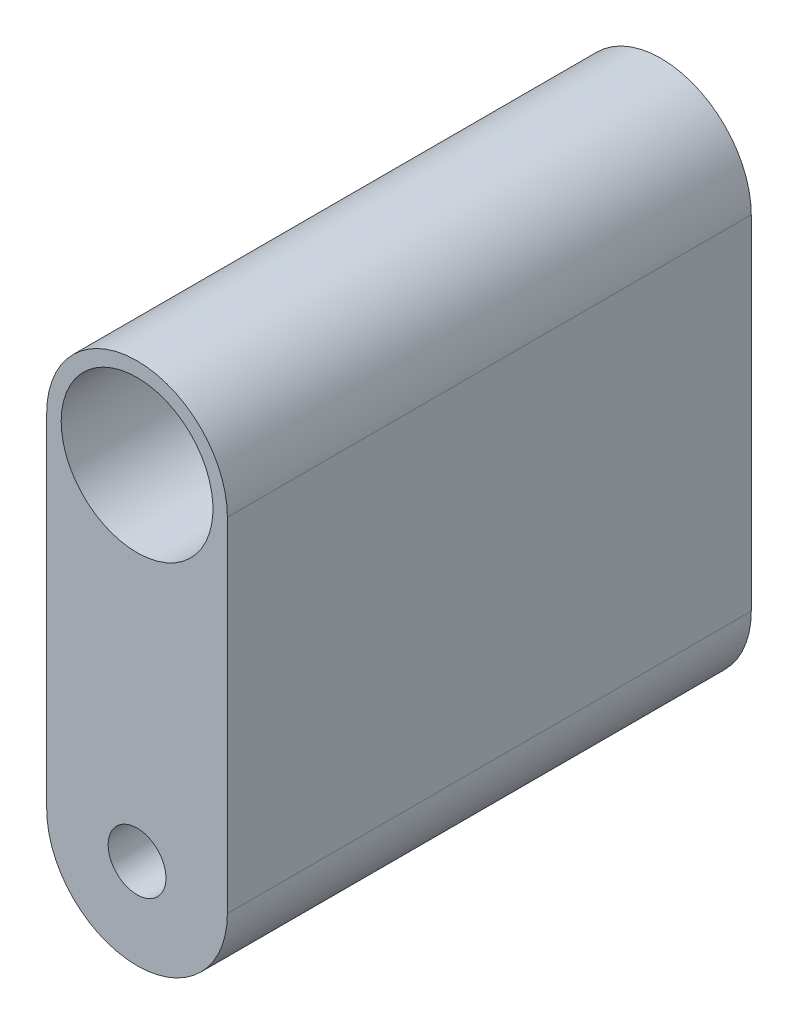
ISO-10303-21;
HEADER;
FILE_DESCRIPTION(('STEP AP214'),'2;1');
FILE_NAME('part.step','',(''),(''),'','','');
FILE_SCHEMA(('AUTOMOTIVE_DESIGN { 1 0 10303 214 1 1 1 1 }'));
ENDSEC;
DATA;
#1=APPLICATION_CONTEXT('core data for automotive mechanical design processes');
#2=APPLICATION_PROTOCOL_DEFINITION('international standard','automotive_design',2000,#1);
#3=PRODUCT_CONTEXT('',#1,'mechanical');
#4=PRODUCT('Part','Part','',(#3));
#5=PRODUCT_RELATED_PRODUCT_CATEGORY('part','',(#4));
#6=PRODUCT_DEFINITION_FORMATION('','',#4);
#7=PRODUCT_DEFINITION_CONTEXT('part definition',#1,'design');
#8=PRODUCT_DEFINITION('design','',#6,#7);
#9=PRODUCT_DEFINITION_SHAPE('','',#8);
#10=(LENGTH_UNIT() NAMED_UNIT(*) SI_UNIT(.MILLI.,.METRE.));
#11=(NAMED_UNIT(*) PLANE_ANGLE_UNIT() SI_UNIT($,.RADIAN.));
#12=(NAMED_UNIT(*) SI_UNIT($,.STERADIAN.) SOLID_ANGLE_UNIT());
#13=UNCERTAINTY_MEASURE_WITH_UNIT(LENGTH_MEASURE(1.E-05),#10,'distance_accuracy_value','');
#14=(GEOMETRIC_REPRESENTATION_CONTEXT(3) GLOBAL_UNCERTAINTY_ASSIGNED_CONTEXT((#13)) GLOBAL_UNIT_ASSIGNED_CONTEXT((#10,
#11,#12)) REPRESENTATION_CONTEXT('',''));
#15=CARTESIAN_POINT('',(0.,0.,0.));
#16=DIRECTION('',(0.,0.,1.));
#17=DIRECTION('',(1.,0.,0.));
#18=AXIS2_PLACEMENT_3D('',#15,#16,#17);
#19=CARTESIAN_POINT('',(0.,0.,29.));
#20=DIRECTION('',(0.,0.,1.));
#21=DIRECTION('',(1.,0.,0.));
#22=AXIS2_PLACEMENT_3D('',#19,#20,#21);
#23=PLANE('',#22);
#24=CARTESIAN_POINT('',(0.,0.,29.));
#25=DIRECTION('',(0.,0.,1.));
#26=DIRECTION('',(1.,0.,0.));
#27=AXIS2_PLACEMENT_3D('',#24,#25,#26);
#28=CIRCLE('',#27,1.6);
#29=CARTESIAN_POINT('',(-1.6,0.,29.));
#30=VERTEX_POINT('',#29);
#31=EDGE_CURVE('E118',#30,#30,#28,.T.);
#32=ORIENTED_EDGE('',*,*,#31,.F.);
#33=EDGE_LOOP('',(#32));
#34=FACE_BOUND('',#33,.T.);
#35=CARTESIAN_POINT('',(0.,0.,29.));
#36=DIRECTION('',(0.,0.,1.));
#37=DIRECTION('',(1.,0.,0.));
#38=AXIS2_PLACEMENT_3D('',#35,#36,#37);
#39=CIRCLE('',#38,5.);
#40=CARTESIAN_POINT('',(-5.,0.,29.));
#41=VERTEX_POINT('',#40);
#42=CARTESIAN_POINT('',(5.,0.,29.));
#43=VERTEX_POINT('',#42);
#44=EDGE_CURVE('E98',#41,#43,#39,.T.);
#45=ORIENTED_EDGE('',*,*,#44,.T.);
#46=DIRECTION('',(0.,1.,0.));
#47=VECTOR('',#46,1.);
#48=CARTESIAN_POINT('',(5.,0.,29.));
#49=LINE('',#48,#47);
#50=CARTESIAN_POINT('',(5.,19.,29.));
#51=VERTEX_POINT('',#50);
#52=EDGE_CURVE('E93',#43,#51,#49,.T.);
#53=ORIENTED_EDGE('',*,*,#52,.T.);
#54=CARTESIAN_POINT('',(0.,19.,29.));
#55=DIRECTION('',(0.,0.,1.));
#56=DIRECTION('',(1.,0.,0.));
#57=AXIS2_PLACEMENT_3D('',#54,#55,#56);
#58=CIRCLE('',#57,5.);
#59=CARTESIAN_POINT('',(-5.,19.,29.));
#60=VERTEX_POINT('',#59);
#61=EDGE_CURVE('E96',#51,#60,#58,.T.);
#62=ORIENTED_EDGE('',*,*,#61,.T.);
#63=DIRECTION('',(0.,-1.,0.));
#64=VECTOR('',#63,1.);
#65=CARTESIAN_POINT('',(-5.,0.,29.));
#66=LINE('',#65,#64);
#67=EDGE_CURVE('E63',#60,#41,#66,.T.);
#68=ORIENTED_EDGE('',*,*,#67,.T.);
#69=EDGE_LOOP('',(#45,#53,#62,#68));
#70=FACE_BOUND('',#69,.T.);
#71=CARTESIAN_POINT('',(0.,19.,29.));
#72=DIRECTION('',(0.,0.,1.));
#73=DIRECTION('',(1.,0.,0.));
#74=AXIS2_PLACEMENT_3D('',#71,#72,#73);
#75=CIRCLE('',#74,4.2);
#76=CARTESIAN_POINT('',(-4.2,19.,29.));
#77=VERTEX_POINT('',#76);
#78=EDGE_CURVE('E140',#77,#77,#75,.T.);
#79=ORIENTED_EDGE('',*,*,#78,.F.);
#80=EDGE_LOOP('',(#79));
#81=FACE_BOUND('',#80,.T.);
#82=ADVANCED_FACE('F45',(#34,#70,#81),#23,.T.);
#83=CARTESIAN_POINT('',(0.,0.,0.));
#84=DIRECTION('',(0.,0.,1.));
#85=DIRECTION('',(1.,0.,0.));
#86=AXIS2_PLACEMENT_3D('',#83,#84,#85);
#87=PLANE('',#86);
#88=CARTESIAN_POINT('',(0.,0.,0.));
#89=DIRECTION('',(0.,0.,1.));
#90=DIRECTION('',(1.,0.,0.));
#91=AXIS2_PLACEMENT_3D('',#88,#89,#90);
#92=CIRCLE('',#91,5.);
#93=CARTESIAN_POINT('',(-5.,0.,0.));
#94=VERTEX_POINT('',#93);
#95=CARTESIAN_POINT('',(5.,0.,0.));
#96=VERTEX_POINT('',#95);
#97=EDGE_CURVE('E114',#94,#96,#92,.T.);
#98=ORIENTED_EDGE('',*,*,#97,.F.);
#99=DIRECTION('',(0.,-1.,0.));
#100=VECTOR('',#99,1.);
#101=CARTESIAN_POINT('',(-5.,0.,0.));
#102=LINE('',#101,#100);
#103=CARTESIAN_POINT('',(-5.,19.,0.));
#104=VERTEX_POINT('',#103);
#105=EDGE_CURVE('E86',#104,#94,#102,.T.);
#106=ORIENTED_EDGE('',*,*,#105,.F.);
#107=CARTESIAN_POINT('',(0.,19.,0.));
#108=DIRECTION('',(0.,0.,1.));
#109=DIRECTION('',(1.,0.,0.));
#110=AXIS2_PLACEMENT_3D('',#107,#108,#109);
#111=CIRCLE('',#110,5.);
#112=CARTESIAN_POINT('',(5.,19.,0.));
#113=VERTEX_POINT('',#112);
#114=EDGE_CURVE('E80',#113,#104,#111,.T.);
#115=ORIENTED_EDGE('',*,*,#114,.F.);
#116=DIRECTION('',(0.,1.,0.));
#117=VECTOR('',#116,1.);
#118=CARTESIAN_POINT('',(5.,0.,0.));
#119=LINE('',#118,#117);
#120=EDGE_CURVE('E103',#96,#113,#119,.T.);
#121=ORIENTED_EDGE('',*,*,#120,.F.);
#122=EDGE_LOOP('',(#98,#106,#115,#121));
#123=FACE_BOUND('',#122,.T.);
#124=CARTESIAN_POINT('',(0.,0.,0.));
#125=DIRECTION('',(0.,0.,1.));
#126=DIRECTION('',(1.,0.,0.));
#127=AXIS2_PLACEMENT_3D('',#124,#125,#126);
#128=CIRCLE('',#127,1.6);
#129=CARTESIAN_POINT('',(-1.6,0.,0.));
#130=VERTEX_POINT('',#129);
#131=EDGE_CURVE('E136',#130,#130,#128,.T.);
#132=ORIENTED_EDGE('',*,*,#131,.T.);
#133=EDGE_LOOP('',(#132));
#134=FACE_BOUND('',#133,.T.);
#135=CARTESIAN_POINT('',(0.,19.,0.));
#136=DIRECTION('',(0.,0.,1.));
#137=DIRECTION('',(1.,0.,0.));
#138=AXIS2_PLACEMENT_3D('',#135,#136,#137);
#139=CIRCLE('',#138,4.2);
#140=CARTESIAN_POINT('',(-4.2,19.,0.));
#141=VERTEX_POINT('',#140);
#142=EDGE_CURVE('E144',#141,#141,#139,.T.);
#143=ORIENTED_EDGE('',*,*,#142,.T.);
#144=EDGE_LOOP('',(#143));
#145=FACE_BOUND('',#144,.T.);
#146=ADVANCED_FACE('F131',(#123,#134,#145),#87,.F.);
#147=CARTESIAN_POINT('',(0.,0.,29.));
#148=DIRECTION('',(0.,0.,-1.));
#149=DIRECTION('',(-1.,0.,0.));
#150=AXIS2_PLACEMENT_3D('',#147,#148,#149);
#151=CYLINDRICAL_SURFACE('',#150,5.);
#152=ORIENTED_EDGE('',*,*,#97,.T.);
#153=DIRECTION('',(0.,0.,-1.));
#154=VECTOR('',#153,1.);
#155=CARTESIAN_POINT('',(5.,0.,29.));
#156=LINE('',#155,#154);
#157=EDGE_CURVE('E11',#43,#96,#156,.T.);
#158=ORIENTED_EDGE('',*,*,#157,.F.);
#159=ORIENTED_EDGE('',*,*,#44,.F.);
#160=DIRECTION('',(0.,0.,-1.));
#161=VECTOR('',#160,1.);
#162=CARTESIAN_POINT('',(-5.,0.,29.));
#163=LINE('',#162,#161);
#164=EDGE_CURVE('E110',#41,#94,#163,.T.);
#165=ORIENTED_EDGE('',*,*,#164,.T.);
#166=EDGE_LOOP('',(#152,#158,#159,#165));
#167=FACE_BOUND('',#166,.T.);
#168=ADVANCED_FACE('F47',(#167),#151,.T.);
#169=CARTESIAN_POINT('',(5.,0.,29.));
#170=DIRECTION('',(-1.,0.,0.));
#171=DIRECTION('',(0.,0.,1.));
#172=AXIS2_PLACEMENT_3D('',#169,#170,#171);
#173=PLANE('',#172);
#174=ORIENTED_EDGE('',*,*,#120,.T.);
#175=DIRECTION('',(0.,0.,-1.));
#176=VECTOR('',#175,1.);
#177=CARTESIAN_POINT('',(5.,19.,29.));
#178=LINE('',#177,#176);
#179=EDGE_CURVE('E55',#51,#113,#178,.T.);
#180=ORIENTED_EDGE('',*,*,#179,.F.);
#181=ORIENTED_EDGE('',*,*,#52,.F.);
#182=ORIENTED_EDGE('',*,*,#157,.T.);
#183=EDGE_LOOP('',(#174,#180,#181,#182));
#184=FACE_BOUND('',#183,.T.);
#185=ADVANCED_FACE('F102',(#184),#173,.F.);
#186=CARTESIAN_POINT('',(0.,19.,29.));
#187=DIRECTION('',(0.,0.,-1.));
#188=DIRECTION('',(-1.,0.,0.));
#189=AXIS2_PLACEMENT_3D('',#186,#187,#188);
#190=CYLINDRICAL_SURFACE('',#189,5.);
#191=ORIENTED_EDGE('',*,*,#114,.T.);
#192=DIRECTION('',(0.,0.,-1.));
#193=VECTOR('',#192,1.);
#194=CARTESIAN_POINT('',(-5.,19.,29.));
#195=LINE('',#194,#193);
#196=EDGE_CURVE('E105',#60,#104,#195,.T.);
#197=ORIENTED_EDGE('',*,*,#196,.F.);
#198=ORIENTED_EDGE('',*,*,#61,.F.);
#199=ORIENTED_EDGE('',*,*,#179,.T.);
#200=EDGE_LOOP('',(#191,#197,#198,#199));
#201=FACE_BOUND('',#200,.T.);
#202=ADVANCED_FACE('F106',(#201),#190,.T.);
#203=CARTESIAN_POINT('',(-5.,0.,29.));
#204=DIRECTION('',(1.,0.,0.));
#205=DIRECTION('',(0.,0.,-1.));
#206=AXIS2_PLACEMENT_3D('',#203,#204,#205);
#207=PLANE('',#206);
#208=ORIENTED_EDGE('',*,*,#105,.T.);
#209=ORIENTED_EDGE('',*,*,#164,.F.);
#210=ORIENTED_EDGE('',*,*,#67,.F.);
#211=ORIENTED_EDGE('',*,*,#196,.T.);
#212=EDGE_LOOP('',(#208,#209,#210,#211));
#213=FACE_BOUND('',#212,.T.);
#214=ADVANCED_FACE('F128',(#213),#207,.F.);
#215=CARTESIAN_POINT('',(0.,0.,29.));
#216=DIRECTION('',(0.,0.,-1.));
#217=DIRECTION('',(-1.,0.,0.));
#218=AXIS2_PLACEMENT_3D('',#215,#216,#217);
#219=CYLINDRICAL_SURFACE('',#218,1.6);
#220=CARTESIAN_POINT('',(-1.6,0.,29.));
#221=CARTESIAN_POINT('',(-1.6,0.,28.6979166666667));
#222=CARTESIAN_POINT('',(-1.6,0.,28.3958333333333));
#223=CARTESIAN_POINT('',(-1.6,0.,27.7916666666667));
#224=CARTESIAN_POINT('',(-1.6,0.,27.4895833333333));
#225=CARTESIAN_POINT('',(-1.6,0.,26.8854166666667));
#226=CARTESIAN_POINT('',(-1.6,0.,26.5833333333333));
#227=CARTESIAN_POINT('',(-1.6,0.,25.9791666666667));
#228=CARTESIAN_POINT('',(-1.6,0.,25.6770833333333));
#229=CARTESIAN_POINT('',(-1.6,0.,25.0729166666667));
#230=CARTESIAN_POINT('',(-1.6,0.,24.7708333333333));
#231=CARTESIAN_POINT('',(-1.6,0.,24.1666666666667));
#232=CARTESIAN_POINT('',(-1.6,0.,23.8645833333333));
#233=CARTESIAN_POINT('',(-1.6,0.,23.2604166666667));
#234=CARTESIAN_POINT('',(-1.6,0.,22.9583333333333));
#235=CARTESIAN_POINT('',(-1.6,0.,22.3541666666667));
#236=CARTESIAN_POINT('',(-1.6,0.,22.0520833333333));
#237=CARTESIAN_POINT('',(-1.6,0.,21.4479166666667));
#238=CARTESIAN_POINT('',(-1.6,0.,21.1458333333333));
#239=CARTESIAN_POINT('',(-1.6,0.,20.5416666666667));
#240=CARTESIAN_POINT('',(-1.6,0.,20.2395833333333));
#241=CARTESIAN_POINT('',(-1.6,0.,19.6354166666667));
#242=CARTESIAN_POINT('',(-1.6,0.,19.3333333333333));
#243=CARTESIAN_POINT('',(-1.6,0.,18.7291666666667));
#244=CARTESIAN_POINT('',(-1.6,0.,18.4270833333333));
#245=CARTESIAN_POINT('',(-1.6,0.,17.8229166666667));
#246=CARTESIAN_POINT('',(-1.6,0.,17.5208333333333));
#247=CARTESIAN_POINT('',(-1.6,0.,16.9166666666667));
#248=CARTESIAN_POINT('',(-1.6,0.,16.6145833333333));
#249=CARTESIAN_POINT('',(-1.6,0.,16.0104166666667));
#250=CARTESIAN_POINT('',(-1.6,0.,15.7083333333333));
#251=CARTESIAN_POINT('',(-1.6,0.,15.1041666666667));
#252=CARTESIAN_POINT('',(-1.6,0.,14.8020833333333));
#253=CARTESIAN_POINT('',(-1.6,0.,14.1979166666667));
#254=CARTESIAN_POINT('',(-1.6,0.,13.8958333333333));
#255=CARTESIAN_POINT('',(-1.6,0.,13.2916666666667));
#256=CARTESIAN_POINT('',(-1.6,0.,12.9895833333333));
#257=CARTESIAN_POINT('',(-1.6,0.,12.3854166666667));
#258=CARTESIAN_POINT('',(-1.6,0.,12.0833333333333));
#259=CARTESIAN_POINT('',(-1.6,0.,11.4791666666667));
#260=CARTESIAN_POINT('',(-1.6,0.,11.1770833333333));
#261=CARTESIAN_POINT('',(-1.6,0.,10.5729166666667));
#262=CARTESIAN_POINT('',(-1.6,0.,10.2708333333333));
#263=CARTESIAN_POINT('',(-1.6,0.,9.66666666666667));
#264=CARTESIAN_POINT('',(-1.6,0.,9.36458333333333));
#265=CARTESIAN_POINT('',(-1.6,0.,8.76041666666667));
#266=CARTESIAN_POINT('',(-1.6,0.,8.45833333333333));
#267=CARTESIAN_POINT('',(-1.6,0.,7.85416666666667));
#268=CARTESIAN_POINT('',(-1.6,0.,7.55208333333333));
#269=CARTESIAN_POINT('',(-1.6,0.,6.94791666666667));
#270=CARTESIAN_POINT('',(-1.6,0.,6.64583333333333));
#271=CARTESIAN_POINT('',(-1.6,0.,6.04166666666667));
#272=CARTESIAN_POINT('',(-1.6,0.,5.73958333333333));
#273=CARTESIAN_POINT('',(-1.6,0.,5.13541666666667));
#274=CARTESIAN_POINT('',(-1.6,0.,4.83333333333333));
#275=CARTESIAN_POINT('',(-1.6,0.,4.22916666666667));
#276=CARTESIAN_POINT('',(-1.6,0.,3.92708333333333));
#277=CARTESIAN_POINT('',(-1.6,0.,3.32291666666667));
#278=CARTESIAN_POINT('',(-1.6,0.,3.02083333333333));
#279=CARTESIAN_POINT('',(-1.6,0.,2.41666666666667));
#280=CARTESIAN_POINT('',(-1.6,0.,2.11458333333333));
#281=CARTESIAN_POINT('',(-1.6,0.,1.51041666666667));
#282=CARTESIAN_POINT('',(-1.6,0.,1.20833333333333));
#283=CARTESIAN_POINT('',(-1.6,0.,0.604166666666667));
#284=CARTESIAN_POINT('',(-1.6,0.,0.302083333333333));
#285=CARTESIAN_POINT('',(-1.6,0.,0.));
#286=B_SPLINE_CURVE_WITH_KNOTS('',3,(#220,#221,#222,#223,#224,#225,#226,#227,#228,#229,#230,
#231,#232,#233,#234,#235,#236,#237,#238,#239,#240,#241,#242,#243,#244,#245,#246,#247,#248,#249,
#250,#251,#252,#253,#254,#255,#256,#257,#258,#259,#260,#261,#262,#263,#264,#265,#266,#267,#268,
#269,#270,#271,#272,#273,#274,#275,#276,#277,#278,#279,#280,#281,#282,#283,#284,#285),
.UNSPECIFIED.,.F.,.F.,(4,2,2,2,2,2,2,2,2,2,2,2,2,2,2,2,2,2,2,2,2,2,2,2,2,2,2,2,2,2,2,2,4),(0.,
0.906249999999997,1.8125,2.71875,3.625,4.53125,5.4375,6.34375,7.25,8.15625,9.0625,9.96875,
10.875,11.78125,12.6875,13.59375,14.5,15.40625,16.3125,17.21875,18.125,19.03125,19.9375,
20.84375,21.75,22.65625,23.5625,24.46875,25.375,26.28125,27.1875,28.09375,29.),.UNSPECIFIED.);
#287=EDGE_CURVE('BSEAM163',#30,#130,#286,.T.);
#288=ORIENTED_EDGE('',*,*,#31,.T.);
#289=ORIENTED_EDGE('',*,*,#131,.F.);
#290=ORIENTED_EDGE('',*,*,#287,.T.);
#291=ORIENTED_EDGE('',*,*,#287,.F.);
#292=EDGE_LOOP('',(#288,#290,#289,#291));
#293=FACE_BOUND('',#292,.T.);
#294=ADVANCED_FACE('F163',(#293),#219,.F.);
#295=CARTESIAN_POINT('',(0.,19.,29.));
#296=DIRECTION('',(0.,0.,-1.));
#297=DIRECTION('',(-1.,0.,0.));
#298=AXIS2_PLACEMENT_3D('',#295,#296,#297);
#299=CYLINDRICAL_SURFACE('',#298,4.2);
#300=CARTESIAN_POINT('',(-4.2,19.,29.));
#301=CARTESIAN_POINT('',(-4.2,19.,28.6979166666667));
#302=CARTESIAN_POINT('',(-4.2,19.,28.3958333333333));
#303=CARTESIAN_POINT('',(-4.2,19.,27.7916666666667));
#304=CARTESIAN_POINT('',(-4.2,19.,27.4895833333333));
#305=CARTESIAN_POINT('',(-4.2,19.,26.8854166666667));
#306=CARTESIAN_POINT('',(-4.2,19.,26.5833333333333));
#307=CARTESIAN_POINT('',(-4.2,19.,25.9791666666667));
#308=CARTESIAN_POINT('',(-4.2,19.,25.6770833333333));
#309=CARTESIAN_POINT('',(-4.2,19.,25.0729166666667));
#310=CARTESIAN_POINT('',(-4.2,19.,24.7708333333333));
#311=CARTESIAN_POINT('',(-4.2,19.,24.1666666666667));
#312=CARTESIAN_POINT('',(-4.2,19.,23.8645833333333));
#313=CARTESIAN_POINT('',(-4.2,19.,23.2604166666667));
#314=CARTESIAN_POINT('',(-4.2,19.,22.9583333333333));
#315=CARTESIAN_POINT('',(-4.2,19.,22.3541666666667));
#316=CARTESIAN_POINT('',(-4.2,19.,22.0520833333333));
#317=CARTESIAN_POINT('',(-4.2,19.,21.4479166666667));
#318=CARTESIAN_POINT('',(-4.2,19.,21.1458333333333));
#319=CARTESIAN_POINT('',(-4.2,19.,20.5416666666667));
#320=CARTESIAN_POINT('',(-4.2,19.,20.2395833333333));
#321=CARTESIAN_POINT('',(-4.2,19.,19.6354166666667));
#322=CARTESIAN_POINT('',(-4.2,19.,19.3333333333333));
#323=CARTESIAN_POINT('',(-4.2,19.,18.7291666666667));
#324=CARTESIAN_POINT('',(-4.2,19.,18.4270833333333));
#325=CARTESIAN_POINT('',(-4.2,19.,17.8229166666667));
#326=CARTESIAN_POINT('',(-4.2,19.,17.5208333333333));
#327=CARTESIAN_POINT('',(-4.2,19.,16.9166666666667));
#328=CARTESIAN_POINT('',(-4.2,19.,16.6145833333333));
#329=CARTESIAN_POINT('',(-4.2,19.,16.0104166666667));
#330=CARTESIAN_POINT('',(-4.2,19.,15.7083333333333));
#331=CARTESIAN_POINT('',(-4.2,19.,15.1041666666667));
#332=CARTESIAN_POINT('',(-4.2,19.,14.8020833333333));
#333=CARTESIAN_POINT('',(-4.2,19.,14.1979166666667));
#334=CARTESIAN_POINT('',(-4.2,19.,13.8958333333333));
#335=CARTESIAN_POINT('',(-4.2,19.,13.2916666666667));
#336=CARTESIAN_POINT('',(-4.2,19.,12.9895833333333));
#337=CARTESIAN_POINT('',(-4.2,19.,12.3854166666667));
#338=CARTESIAN_POINT('',(-4.2,19.,12.0833333333333));
#339=CARTESIAN_POINT('',(-4.2,19.,11.4791666666667));
#340=CARTESIAN_POINT('',(-4.2,19.,11.1770833333333));
#341=CARTESIAN_POINT('',(-4.2,19.,10.5729166666667));
#342=CARTESIAN_POINT('',(-4.2,19.,10.2708333333333));
#343=CARTESIAN_POINT('',(-4.2,19.,9.66666666666667));
#344=CARTESIAN_POINT('',(-4.2,19.,9.36458333333333));
#345=CARTESIAN_POINT('',(-4.2,19.,8.76041666666667));
#346=CARTESIAN_POINT('',(-4.2,19.,8.45833333333333));
#347=CARTESIAN_POINT('',(-4.2,19.,7.85416666666667));
#348=CARTESIAN_POINT('',(-4.2,19.,7.55208333333333));
#349=CARTESIAN_POINT('',(-4.2,19.,6.94791666666667));
#350=CARTESIAN_POINT('',(-4.2,19.,6.64583333333333));
#351=CARTESIAN_POINT('',(-4.2,19.,6.04166666666667));
#352=CARTESIAN_POINT('',(-4.2,19.,5.73958333333333));
#353=CARTESIAN_POINT('',(-4.2,19.,5.13541666666667));
#354=CARTESIAN_POINT('',(-4.2,19.,4.83333333333333));
#355=CARTESIAN_POINT('',(-4.2,19.,4.22916666666667));
#356=CARTESIAN_POINT('',(-4.2,19.,3.92708333333333));
#357=CARTESIAN_POINT('',(-4.2,19.,3.32291666666667));
#358=CARTESIAN_POINT('',(-4.2,19.,3.02083333333333));
#359=CARTESIAN_POINT('',(-4.2,19.,2.41666666666667));
#360=CARTESIAN_POINT('',(-4.2,19.,2.11458333333333));
#361=CARTESIAN_POINT('',(-4.2,19.,1.51041666666667));
#362=CARTESIAN_POINT('',(-4.2,19.,1.20833333333333));
#363=CARTESIAN_POINT('',(-4.2,19.,0.604166666666667));
#364=CARTESIAN_POINT('',(-4.2,19.,0.302083333333333));
#365=CARTESIAN_POINT('',(-4.2,19.,0.));
#366=B_SPLINE_CURVE_WITH_KNOTS('',3,(#300,#301,#302,#303,#304,#305,#306,#307,#308,#309,#310,
#311,#312,#313,#314,#315,#316,#317,#318,#319,#320,#321,#322,#323,#324,#325,#326,#327,#328,#329,
#330,#331,#332,#333,#334,#335,#336,#337,#338,#339,#340,#341,#342,#343,#344,#345,#346,#347,#348,
#349,#350,#351,#352,#353,#354,#355,#356,#357,#358,#359,#360,#361,#362,#363,#364,#365),
.UNSPECIFIED.,.F.,.F.,(4,2,2,2,2,2,2,2,2,2,2,2,2,2,2,2,2,2,2,2,2,2,2,2,2,2,2,2,2,2,2,2,4),(0.,
0.906249999999997,1.8125,2.71875,3.625,4.53125,5.4375,6.34375,7.25,8.15625,9.0625,9.96875,
10.875,11.78125,12.6875,13.59375,14.5,15.40625,16.3125,17.21875,18.125,19.03125,19.9375,
20.84375,21.75,22.65625,23.5625,24.46875,25.375,26.28125,27.1875,28.09375,29.),.UNSPECIFIED.);
#367=EDGE_CURVE('BSEAM152',#77,#141,#366,.T.);
#368=ORIENTED_EDGE('',*,*,#78,.T.);
#369=ORIENTED_EDGE('',*,*,#142,.F.);
#370=ORIENTED_EDGE('',*,*,#367,.T.);
#371=ORIENTED_EDGE('',*,*,#367,.F.);
#372=EDGE_LOOP('',(#368,#370,#369,#371));
#373=FACE_BOUND('',#372,.T.);
#374=ADVANCED_FACE('F152',(#373),#299,.F.);
#375=CLOSED_SHELL('',(#82,#146,#168,#185,#202,#214,#294,#374));
#376=MANIFOLD_SOLID_BREP('B2',#375);
#377=ADVANCED_BREP_SHAPE_REPRESENTATION('',(#18,#376),#14);
#378=SHAPE_DEFINITION_REPRESENTATION(#9,#377);
ENDSEC;
END-ISO-10303-21;
